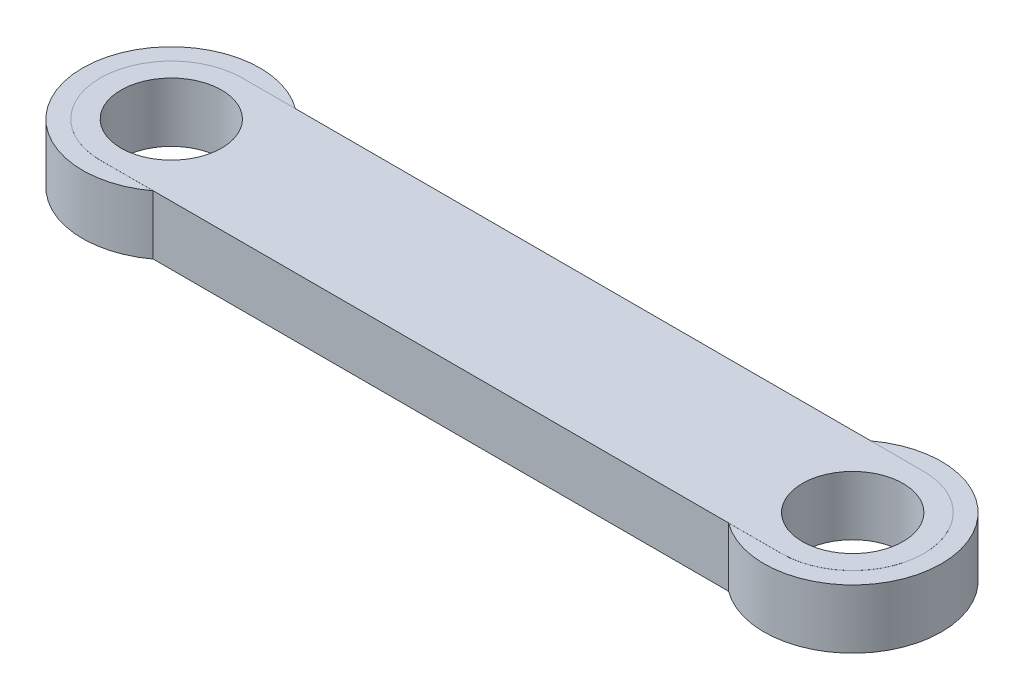
ISO-10303-21;
HEADER;
FILE_DESCRIPTION(('STEP AP214'),'2;1');
FILE_NAME('part.step','',(''),(''),'','','');
FILE_SCHEMA(('AUTOMOTIVE_DESIGN { 1 0 10303 214 1 1 1 1 }'));
ENDSEC;
DATA;
#1=APPLICATION_CONTEXT('core data for automotive mechanical design processes');
#2=APPLICATION_PROTOCOL_DEFINITION('international standard','automotive_design',2000,#1);
#3=PRODUCT_CONTEXT('',#1,'mechanical');
#4=PRODUCT('Part','Part','',(#3));
#5=PRODUCT_RELATED_PRODUCT_CATEGORY('part','',(#4));
#6=PRODUCT_DEFINITION_FORMATION('','',#4);
#7=PRODUCT_DEFINITION_CONTEXT('part definition',#1,'design');
#8=PRODUCT_DEFINITION('design','',#6,#7);
#9=PRODUCT_DEFINITION_SHAPE('','',#8);
#10=(LENGTH_UNIT() NAMED_UNIT(*) SI_UNIT(.MILLI.,.METRE.));
#11=(NAMED_UNIT(*) PLANE_ANGLE_UNIT() SI_UNIT($,.RADIAN.));
#12=(NAMED_UNIT(*) SI_UNIT($,.STERADIAN.) SOLID_ANGLE_UNIT());
#13=UNCERTAINTY_MEASURE_WITH_UNIT(LENGTH_MEASURE(1.E-05),#10,'distance_accuracy_value','');
#14=(GEOMETRIC_REPRESENTATION_CONTEXT(3) GLOBAL_UNCERTAINTY_ASSIGNED_CONTEXT((#13)) GLOBAL_UNIT_ASSIGNED_CONTEXT((#10,
#11,#12)) REPRESENTATION_CONTEXT('',''));
#15=CARTESIAN_POINT('',(0.,0.,0.));
#16=DIRECTION('',(0.,0.,1.));
#17=DIRECTION('',(1.,0.,0.));
#18=AXIS2_PLACEMENT_3D('',#15,#16,#17);
#19=CARTESIAN_POINT('',(-13.0494036010891,3.001,0.));
#20=DIRECTION('',(0.,-1.,0.));
#21=DIRECTION('',(0.,0.,-1.));
#22=AXIS2_PLACEMENT_3D('',#19,#20,#21);
#23=CYLINDRICAL_SURFACE('',#22,2.4048);
#24=CARTESIAN_POINT('',(-13.0494036010891,2.999,0.));
#25=DIRECTION('',(0.,1.,0.));
#26=DIRECTION('',(0.,0.,-1.));
#27=AXIS2_PLACEMENT_3D('',#24,#25,#26);
#28=CIRCLE('',#27,2.4048);
#29=CARTESIAN_POINT('',(-13.0494036010891,2.999,-2.4048));
#30=VERTEX_POINT('',#29);
#31=CARTESIAN_POINT('',(-13.0494036010891,2.999,2.4048));
#32=VERTEX_POINT('',#31);
#33=EDGE_CURVE('E152',#30,#32,#28,.T.);
#34=ORIENTED_EDGE('',*,*,#33,.T.);
#35=DIRECTION('',(0.,-1.,0.));
#36=VECTOR('',#35,1.);
#37=CARTESIAN_POINT('',(-13.0494036010891,3.001,2.4048));
#38=LINE('',#37,#36);
#39=CARTESIAN_POINT('',(-13.0494036010891,3.001,2.4048));
#40=VERTEX_POINT('',#39);
#41=EDGE_CURVE('E120',#40,#32,#38,.T.);
#42=ORIENTED_EDGE('',*,*,#41,.F.);
#43=CARTESIAN_POINT('',(-13.0494036010891,3.001,0.));
#44=DIRECTION('',(0.,1.,0.));
#45=DIRECTION('',(0.,0.,1.));
#46=AXIS2_PLACEMENT_3D('',#43,#44,#45);
#47=CIRCLE('',#46,2.4048);
#48=CARTESIAN_POINT('',(-13.0494036010891,3.001,-2.4048));
#49=VERTEX_POINT('',#48);
#50=EDGE_CURVE('E9',#49,#40,#47,.T.);
#51=ORIENTED_EDGE('',*,*,#50,.F.);
#52=DIRECTION('',(0.,-1.,0.));
#53=VECTOR('',#52,1.);
#54=CARTESIAN_POINT('',(-13.0494036010891,1.999,-2.4048));
#55=LINE('',#54,#53);
#56=EDGE_CURVE('E117',#49,#30,#55,.T.);
#57=ORIENTED_EDGE('',*,*,#56,.T.);
#58=EDGE_LOOP('',(#34,#42,#51,#57));
#59=FACE_BOUND('',#58,.T.);
#60=ADVANCED_FACE('F14',(#59),#23,.T.);
#61=CARTESIAN_POINT('',(-13.0494036010891,3.001,0.));
#62=DIRECTION('',(0.,1.,0.));
#63=DIRECTION('',(1.,0.,0.));
#64=AXIS2_PLACEMENT_3D('',#61,#62,#63);
#65=PLANE('',#64);
#66=CARTESIAN_POINT('',(-13.0494036010891,3.001,0.));
#67=DIRECTION('',(0.,1.,0.));
#68=DIRECTION('',(0.,0.,-1.));
#69=AXIS2_PLACEMENT_3D('',#66,#67,#68);
#70=CIRCLE('',#69,1.702);
#71=CARTESIAN_POINT('',(-13.0494036010891,3.001,1.702));
#72=VERTEX_POINT('',#71);
#73=EDGE_CURVE('E168',#72,#72,#70,.T.);
#74=ORIENTED_EDGE('',*,*,#73,.F.);
#75=EDGE_LOOP('',(#74));
#76=FACE_BOUND('',#75,.T.);
#77=CARTESIAN_POINT('',(9.99659639891087,3.001,0.));
#78=DIRECTION('',(0.,1.,0.));
#79=DIRECTION('',(0.,0.,-1.));
#80=AXIS2_PLACEMENT_3D('',#77,#78,#79);
#81=CIRCLE('',#80,1.703);
#82=CARTESIAN_POINT('',(9.99659639891087,3.001,1.703));
#83=VERTEX_POINT('',#82);
#84=EDGE_CURVE('E163',#83,#83,#81,.T.);
#85=ORIENTED_EDGE('',*,*,#84,.F.);
#86=EDGE_LOOP('',(#85));
#87=FACE_BOUND('',#86,.T.);
#88=ORIENTED_EDGE('',*,*,#50,.T.);
#89=DIRECTION('',(1.,0.,0.));
#90=VECTOR('',#89,1.);
#91=CARTESIAN_POINT('',(-13.0494036010891,3.001,2.4048));
#92=LINE('',#91,#90);
#93=CARTESIAN_POINT('',(9.99659639891087,3.001,2.4048));
#94=VERTEX_POINT('',#93);
#95=EDGE_CURVE('E217',#40,#94,#92,.T.);
#96=ORIENTED_EDGE('',*,*,#95,.T.);
#97=CARTESIAN_POINT('',(9.99659639891087,3.001,0.));
#98=DIRECTION('',(0.,1.,0.));
#99=DIRECTION('',(0.,0.,1.));
#100=AXIS2_PLACEMENT_3D('',#97,#98,#99);
#101=CIRCLE('',#100,2.4048);
#102=CARTESIAN_POINT('',(9.99659639891087,3.001,-2.4048));
#103=VERTEX_POINT('',#102);
#104=EDGE_CURVE('E127',#94,#103,#101,.T.);
#105=ORIENTED_EDGE('',*,*,#104,.T.);
#106=DIRECTION('',(-1.,0.,0.));
#107=VECTOR('',#106,1.);
#108=CARTESIAN_POINT('',(-13.0494036010891,3.001,-2.4048));
#109=LINE('',#108,#107);
#110=EDGE_CURVE('E125',#103,#49,#109,.T.);
#111=ORIENTED_EDGE('',*,*,#110,.T.);
#112=EDGE_LOOP('',(#88,#96,#105,#111));
#113=FACE_BOUND('',#112,.T.);
#114=ADVANCED_FACE('F126',(#76,#87,#113),#65,.T.);
#115=CARTESIAN_POINT('',(-13.0494036010891,3.001,0.));
#116=DIRECTION('',(0.,-1.,0.));
#117=DIRECTION('',(0.,0.,-1.));
#118=AXIS2_PLACEMENT_3D('',#115,#116,#117);
#119=CYLINDRICAL_SURFACE('',#118,1.702);
#120=ORIENTED_EDGE('',*,*,#73,.T.);
#121=DIRECTION('',(0.,-1.,0.));
#122=VECTOR('',#121,1.);
#123=CARTESIAN_POINT('',(-13.0494036010891,3.001,1.702));
#124=LINE('',#123,#122);
#125=CARTESIAN_POINT('',(-13.0494036010891,0.999,1.702));
#126=VERTEX_POINT('',#125);
#127=EDGE_CURVE('E22',#72,#126,#124,.T.);
#128=ORIENTED_EDGE('',*,*,#127,.T.);
#129=CARTESIAN_POINT('',(-13.0494036010891,0.999,0.));
#130=DIRECTION('',(0.,1.,0.));
#131=DIRECTION('',(0.,0.,-1.));
#132=AXIS2_PLACEMENT_3D('',#129,#130,#131);
#133=CIRCLE('',#132,1.702);
#134=EDGE_CURVE('E155',#126,#126,#133,.T.);
#135=ORIENTED_EDGE('',*,*,#134,.F.);
#136=ORIENTED_EDGE('',*,*,#127,.F.);
#137=EDGE_LOOP('',(#120,#128,#135,#136));
#138=FACE_BOUND('',#137,.T.);
#139=ADVANCED_FACE('F173',(#138),#119,.F.);
#140=CARTESIAN_POINT('',(9.99659639891087,3.001,0.));
#141=DIRECTION('',(0.,-1.,0.));
#142=DIRECTION('',(0.,0.,-1.));
#143=AXIS2_PLACEMENT_3D('',#140,#141,#142);
#144=CYLINDRICAL_SURFACE('',#143,1.703);
#145=ORIENTED_EDGE('',*,*,#84,.T.);
#146=DIRECTION('',(0.,-1.,0.));
#147=VECTOR('',#146,1.);
#148=CARTESIAN_POINT('',(9.99659639891087,3.001,1.703));
#149=LINE('',#148,#147);
#150=CARTESIAN_POINT('',(9.99659639891087,0.999,1.703));
#151=VERTEX_POINT('',#150);
#152=EDGE_CURVE('E42',#83,#151,#149,.T.);
#153=ORIENTED_EDGE('',*,*,#152,.T.);
#154=CARTESIAN_POINT('',(9.99659639891087,0.999,0.));
#155=DIRECTION('',(0.,1.,0.));
#156=DIRECTION('',(0.,0.,-1.));
#157=AXIS2_PLACEMENT_3D('',#154,#155,#156);
#158=CIRCLE('',#157,1.703);
#159=EDGE_CURVE('E159',#151,#151,#158,.T.);
#160=ORIENTED_EDGE('',*,*,#159,.F.);
#161=ORIENTED_EDGE('',*,*,#152,.F.);
#162=EDGE_LOOP('',(#145,#153,#160,#161));
#163=FACE_BOUND('',#162,.T.);
#164=ADVANCED_FACE('F180',(#163),#144,.F.);
#165=CARTESIAN_POINT('',(-13.0494036010891,0.999,0.));
#166=DIRECTION('',(0.,1.,0.));
#167=DIRECTION('',(1.,0.,0.));
#168=AXIS2_PLACEMENT_3D('',#165,#166,#167);
#169=PLANE('',#168);
#170=ORIENTED_EDGE('',*,*,#159,.T.);
#171=EDGE_LOOP('',(#170));
#172=FACE_BOUND('',#171,.T.);
#173=ORIENTED_EDGE('',*,*,#134,.T.);
#174=EDGE_LOOP('',(#173));
#175=FACE_BOUND('',#174,.T.);
#176=CARTESIAN_POINT('',(-13.0494036010891,0.999,0.));
#177=DIRECTION('',(0.,-1.,0.));
#178=DIRECTION('',(0.939593778380299,0.,-0.342291588603977));
#179=AXIS2_PLACEMENT_3D('',#176,#177,#178);
#180=CIRCLE('',#179,3.);
#181=CARTESIAN_POINT('',(-11.2558214423911,0.999,2.4048));
#182=VERTEX_POINT('',#181);
#183=CARTESIAN_POINT('',(-11.2558214423911,0.999,-2.40480000000003));
#184=VERTEX_POINT('',#183);
#185=EDGE_CURVE('E131',#182,#184,#180,.T.);
#186=ORIENTED_EDGE('',*,*,#185,.T.);
#187=DIRECTION('',(1.,0.,0.));
#188=VECTOR('',#187,1.);
#189=CARTESIAN_POINT('',(-13.0494036010891,0.999,-2.4048));
#190=LINE('',#189,#188);
#191=CARTESIAN_POINT('',(8.20301424021281,0.999,-2.40480000000003));
#192=VERTEX_POINT('',#191);
#193=EDGE_CURVE('E187',#184,#192,#190,.T.);
#194=ORIENTED_EDGE('',*,*,#193,.T.);
#195=CARTESIAN_POINT('',(9.99659639891086,0.999,0.));
#196=DIRECTION('',(0.,-1.,0.));
#197=DIRECTION('',(0.939593778380299,0.,-0.342291588603977));
#198=AXIS2_PLACEMENT_3D('',#195,#196,#197);
#199=CIRCLE('',#198,3.);
#200=CARTESIAN_POINT('',(8.20301424021281,0.999,2.4048));
#201=VERTEX_POINT('',#200);
#202=EDGE_CURVE('E244',#192,#201,#199,.T.);
#203=ORIENTED_EDGE('',*,*,#202,.T.);
#204=DIRECTION('',(-1.,0.,0.));
#205=VECTOR('',#204,1.);
#206=CARTESIAN_POINT('',(-13.0494036010891,0.999,2.4048));
#207=LINE('',#206,#205);
#208=EDGE_CURVE('E189',#201,#182,#207,.T.);
#209=ORIENTED_EDGE('',*,*,#208,.T.);
#210=EDGE_LOOP('',(#186,#194,#203,#209));
#211=FACE_BOUND('',#210,.T.);
#212=ADVANCED_FACE('F176',(#172,#175,#211),#169,.F.);
#213=CARTESIAN_POINT('',(-13.2803644667346,2.999,0.0841384473015405));
#214=DIRECTION('',(0.,-1.,0.));
#215=DIRECTION('',(-1.,0.,0.));
#216=AXIS2_PLACEMENT_3D('',#213,#214,#215);
#217=PLANE('',#216);
#218=CARTESIAN_POINT('',(-13.0494036010891,2.999,0.));
#219=DIRECTION('',(0.,1.,0.));
#220=DIRECTION('',(0.939593778380299,0.,-0.342291588603977));
#221=AXIS2_PLACEMENT_3D('',#218,#219,#220);
#222=CIRCLE('',#221,3.);
#223=CARTESIAN_POINT('',(-11.2558214423911,2.999,-2.40480000000003));
#224=VERTEX_POINT('',#223);
#225=CARTESIAN_POINT('',(-11.2558214423911,2.999,2.4048));
#226=VERTEX_POINT('',#225);
#227=EDGE_CURVE('E149',#224,#226,#222,.T.);
#228=ORIENTED_EDGE('',*,*,#227,.T.);
#229=DIRECTION('',(1.,0.,0.));
#230=VECTOR('',#229,1.);
#231=CARTESIAN_POINT('',(-13.1648840339118,2.999,2.4048));
#232=LINE('',#231,#230);
#233=EDGE_CURVE('E213',#32,#226,#232,.T.);
#234=ORIENTED_EDGE('',*,*,#233,.F.);
#235=ORIENTED_EDGE('',*,*,#33,.F.);
#236=DIRECTION('',(-1.,0.,0.));
#237=VECTOR('',#236,1.);
#238=CARTESIAN_POINT('',(-13.1648840339118,2.999,-2.4048));
#239=LINE('',#238,#237);
#240=EDGE_CURVE('E136',#224,#30,#239,.T.);
#241=ORIENTED_EDGE('',*,*,#240,.F.);
#242=EDGE_LOOP('',(#228,#234,#235,#241));
#243=FACE_BOUND('',#242,.T.);
#244=ADVANCED_FACE('F179',(#243),#217,.F.);
#245=CARTESIAN_POINT('',(-13.0494036010891,0.999,0.));
#246=DIRECTION('',(0.,1.,0.));
#247=DIRECTION('',(-1.,0.,0.));
#248=AXIS2_PLACEMENT_3D('',#245,#246,#247);
#249=CYLINDRICAL_SURFACE('',#248,3.);
#250=ORIENTED_EDGE('',*,*,#185,.F.);
#251=DIRECTION('',(0.,-1.,0.));
#252=VECTOR('',#251,1.);
#253=CARTESIAN_POINT('',(-11.2558214423911,0.999,2.4048));
#254=LINE('',#253,#252);
#255=EDGE_CURVE('E210',#226,#182,#254,.T.);
#256=ORIENTED_EDGE('',*,*,#255,.F.);
#257=ORIENTED_EDGE('',*,*,#227,.F.);
#258=DIRECTION('',(0.,1.,0.));
#259=VECTOR('',#258,1.);
#260=CARTESIAN_POINT('',(-11.2558214423911,0.999,-2.4048));
#261=LINE('',#260,#259);
#262=EDGE_CURVE('E143',#184,#224,#261,.T.);
#263=ORIENTED_EDGE('',*,*,#262,.F.);
#264=EDGE_LOOP('',(#250,#256,#257,#263));
#265=FACE_BOUND('',#264,.T.);
#266=ADVANCED_FACE('F193',(#265),#249,.T.);
#267=CARTESIAN_POINT('',(-13.0494036010891,3.001,-2.4048));
#268=DIRECTION('',(0.,0.,1.));
#269=DIRECTION('',(1.,0.,0.));
#270=AXIS2_PLACEMENT_3D('',#267,#268,#269);
#271=PLANE('',#270);
#272=DIRECTION('',(-1.,0.,0.));
#273=VECTOR('',#272,1.);
#274=CARTESIAN_POINT('',(-1.41092316826643,2.999,-2.4048));
#275=LINE('',#274,#273);
#276=CARTESIAN_POINT('',(9.99659639891086,2.999,-2.40480000000003));
#277=VERTEX_POINT('',#276);
#278=CARTESIAN_POINT('',(8.20301424021281,2.999,-2.40480000000003));
#279=VERTEX_POINT('',#278);
#280=EDGE_CURVE('E226',#277,#279,#275,.T.);
#281=ORIENTED_EDGE('',*,*,#280,.T.);
#282=DIRECTION('',(0.,-1.,0.));
#283=VECTOR('',#282,1.);
#284=CARTESIAN_POINT('',(8.20301424021278,0.999,-2.4048));
#285=LINE('',#284,#283);
#286=EDGE_CURVE('E196',#279,#192,#285,.T.);
#287=ORIENTED_EDGE('',*,*,#286,.T.);
#288=ORIENTED_EDGE('',*,*,#193,.F.);
#289=ORIENTED_EDGE('',*,*,#262,.T.);
#290=ORIENTED_EDGE('',*,*,#240,.T.);
#291=ORIENTED_EDGE('',*,*,#56,.F.);
#292=ORIENTED_EDGE('',*,*,#110,.F.);
#293=DIRECTION('',(0.,-1.,0.));
#294=VECTOR('',#293,1.);
#295=CARTESIAN_POINT('',(9.99659639891087,1.999,-2.4048));
#296=LINE('',#295,#294);
#297=EDGE_CURVE('E203',#103,#277,#296,.T.);
#298=ORIENTED_EDGE('',*,*,#297,.T.);
#299=EDGE_LOOP('',(#281,#287,#288,#289,#290,#291,#292,#298));
#300=FACE_BOUND('',#299,.T.);
#301=ADVANCED_FACE('F133',(#300),#271,.F.);
#302=CARTESIAN_POINT('',(9.99659639891087,3.001,0.));
#303=DIRECTION('',(0.,-1.,0.));
#304=DIRECTION('',(0.,0.,-1.));
#305=AXIS2_PLACEMENT_3D('',#302,#303,#304);
#306=CYLINDRICAL_SURFACE('',#305,2.4048);
#307=CARTESIAN_POINT('',(9.99659639891087,2.999,0.));
#308=DIRECTION('',(0.,1.,0.));
#309=DIRECTION('',(0.,0.,-1.));
#310=AXIS2_PLACEMENT_3D('',#307,#308,#309);
#311=CIRCLE('',#310,2.4048);
#312=CARTESIAN_POINT('',(9.99659639891086,2.999,2.4048));
#313=VERTEX_POINT('',#312);
#314=EDGE_CURVE('E222',#313,#277,#311,.T.);
#315=ORIENTED_EDGE('',*,*,#314,.T.);
#316=ORIENTED_EDGE('',*,*,#297,.F.);
#317=ORIENTED_EDGE('',*,*,#104,.F.);
#318=DIRECTION('',(0.,-1.,0.));
#319=VECTOR('',#318,1.);
#320=CARTESIAN_POINT('',(9.99659639891087,1.999,2.4048));
#321=LINE('',#320,#319);
#322=EDGE_CURVE('E214',#94,#313,#321,.T.);
#323=ORIENTED_EDGE('',*,*,#322,.T.);
#324=EDGE_LOOP('',(#315,#316,#317,#323));
#325=FACE_BOUND('',#324,.T.);
#326=ADVANCED_FACE('F256',(#325),#306,.T.);
#327=CARTESIAN_POINT('',(-13.0494036010891,3.001,2.4048));
#328=DIRECTION('',(0.,0.,-1.));
#329=DIRECTION('',(-1.,0.,0.));
#330=AXIS2_PLACEMENT_3D('',#327,#328,#329);
#331=PLANE('',#330);
#332=DIRECTION('',(0.,1.,0.));
#333=VECTOR('',#332,1.);
#334=CARTESIAN_POINT('',(8.20301424021281,0.999,2.4048));
#335=LINE('',#334,#333);
#336=CARTESIAN_POINT('',(8.20301424021281,2.999,2.4048));
#337=VERTEX_POINT('',#336);
#338=EDGE_CURVE('E231',#201,#337,#335,.T.);
#339=ORIENTED_EDGE('',*,*,#338,.T.);
#340=DIRECTION('',(1.,0.,0.));
#341=VECTOR('',#340,1.);
#342=CARTESIAN_POINT('',(-1.41092316826643,2.999,2.4048));
#343=LINE('',#342,#341);
#344=EDGE_CURVE('E218',#337,#313,#343,.T.);
#345=ORIENTED_EDGE('',*,*,#344,.T.);
#346=ORIENTED_EDGE('',*,*,#322,.F.);
#347=ORIENTED_EDGE('',*,*,#95,.F.);
#348=ORIENTED_EDGE('',*,*,#41,.T.);
#349=ORIENTED_EDGE('',*,*,#233,.T.);
#350=ORIENTED_EDGE('',*,*,#255,.T.);
#351=ORIENTED_EDGE('',*,*,#208,.F.);
#352=EDGE_LOOP('',(#339,#345,#346,#347,#348,#349,#350,#351));
#353=FACE_BOUND('',#352,.T.);
#354=ADVANCED_FACE('F251',(#353),#331,.F.);
#355=CARTESIAN_POINT('',(10.2275572645563,2.999,-0.084138447301576));
#356=DIRECTION('',(0.,-1.,0.));
#357=DIRECTION('',(-1.,0.,0.));
#358=AXIS2_PLACEMENT_3D('',#355,#356,#357);
#359=PLANE('',#358);
#360=ORIENTED_EDGE('',*,*,#280,.F.);
#361=ORIENTED_EDGE('',*,*,#314,.F.);
#362=ORIENTED_EDGE('',*,*,#344,.F.);
#363=CARTESIAN_POINT('',(9.99659639891086,2.999,0.));
#364=DIRECTION('',(0.,1.,0.));
#365=DIRECTION('',(0.939593778380299,0.,-0.342291588603977));
#366=AXIS2_PLACEMENT_3D('',#363,#364,#365);
#367=CIRCLE('',#366,3.);
#368=EDGE_CURVE('E235',#337,#279,#367,.T.);
#369=ORIENTED_EDGE('',*,*,#368,.T.);
#370=EDGE_LOOP('',(#360,#361,#362,#369));
#371=FACE_BOUND('',#370,.T.);
#372=ADVANCED_FACE('F260',(#371),#359,.F.);
#373=CARTESIAN_POINT('',(9.99659639891086,0.999,0.));
#374=DIRECTION('',(0.,1.,0.));
#375=DIRECTION('',(0.939593778380299,0.,-0.342291588603977));
#376=AXIS2_PLACEMENT_3D('',#373,#374,#375);
#377=CYLINDRICAL_SURFACE('',#376,3.);
#378=ORIENTED_EDGE('',*,*,#202,.F.);
#379=ORIENTED_EDGE('',*,*,#286,.F.);
#380=ORIENTED_EDGE('',*,*,#368,.F.);
#381=ORIENTED_EDGE('',*,*,#338,.F.);
#382=EDGE_LOOP('',(#378,#379,#380,#381));
#383=FACE_BOUND('',#382,.T.);
#384=ADVANCED_FACE('F263',(#383),#377,.T.);
#385=CLOSED_SHELL('',(#60,#114,#139,#164,#212,#244,#266,#301,#326,#354,#372,#384));
#386=MANIFOLD_SOLID_BREP('B1',#385);
#387=ADVANCED_BREP_SHAPE_REPRESENTATION('',(#18,#386),#14);
#388=SHAPE_DEFINITION_REPRESENTATION(#9,#387);
ENDSEC;
END-ISO-10303-21;
